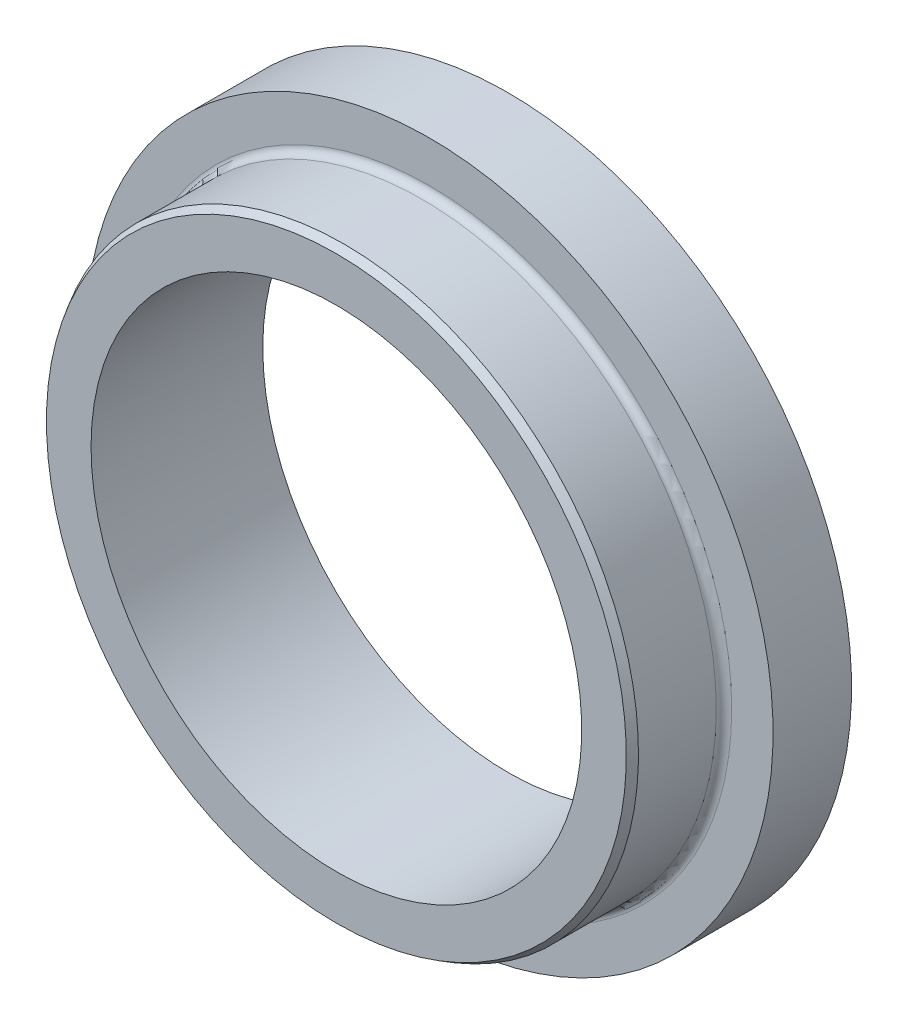
ISO-10303-21;
HEADER;
FILE_DESCRIPTION(('STEP AP214'),'2;1');
FILE_NAME('part.step','',(''),(''),'','','');
FILE_SCHEMA(('AUTOMOTIVE_DESIGN { 1 0 10303 214 1 1 1 1 }'));
ENDSEC;
DATA;
#1=APPLICATION_CONTEXT('core data for automotive mechanical design processes');
#2=APPLICATION_PROTOCOL_DEFINITION('international standard','automotive_design',2000,#1);
#3=PRODUCT_CONTEXT('',#1,'mechanical');
#4=PRODUCT('Part','Part','',(#3));
#5=PRODUCT_RELATED_PRODUCT_CATEGORY('part','',(#4));
#6=PRODUCT_DEFINITION_FORMATION('','',#4);
#7=PRODUCT_DEFINITION_CONTEXT('part definition',#1,'design');
#8=PRODUCT_DEFINITION('design','',#6,#7);
#9=PRODUCT_DEFINITION_SHAPE('','',#8);
#10=(LENGTH_UNIT() NAMED_UNIT(*) SI_UNIT(.MILLI.,.METRE.));
#11=(NAMED_UNIT(*) PLANE_ANGLE_UNIT() SI_UNIT($,.RADIAN.));
#12=(NAMED_UNIT(*) SI_UNIT($,.STERADIAN.) SOLID_ANGLE_UNIT());
#13=UNCERTAINTY_MEASURE_WITH_UNIT(LENGTH_MEASURE(1.E-05),#10,'distance_accuracy_value','');
#14=(GEOMETRIC_REPRESENTATION_CONTEXT(3) GLOBAL_UNCERTAINTY_ASSIGNED_CONTEXT((#13)) GLOBAL_UNIT_ASSIGNED_CONTEXT((#10,
#11,#12)) REPRESENTATION_CONTEXT('',''));
#15=CARTESIAN_POINT('',(0.,0.,0.));
#16=DIRECTION('',(0.,0.,1.));
#17=DIRECTION('',(1.,0.,0.));
#18=AXIS2_PLACEMENT_3D('',#15,#16,#17);
#19=CARTESIAN_POINT('',(0.,0.,11.1125));
#20=DIRECTION('',(0.,0.,-1.));
#21=DIRECTION('',(-1.,0.,0.));
#22=AXIS2_PLACEMENT_3D('',#19,#20,#21);
#23=CYLINDRICAL_SURFACE('',#22,19.05);
#24=CARTESIAN_POINT('',(0.,0.,10.6125));
#25=DIRECTION('',(0.,0.,-1.));
#26=DIRECTION('',(-1.,0.,0.));
#27=AXIS2_PLACEMENT_3D('',#24,#25,#26);
#28=CIRCLE('',#27,19.05);
#29=CARTESIAN_POINT('',(-19.05,0.,10.6125));
#30=VERTEX_POINT('',#29);
#31=EDGE_CURVE('E40',#30,#30,#28,.F.);
#32=ORIENTED_EDGE('',*,*,#31,.F.);
#33=EDGE_LOOP('',(#32));
#34=FACE_BOUND('',#33,.T.);
#35=CARTESIAN_POINT('',(0.,0.,5.58));
#36=DIRECTION('',(0.,0.,-1.));
#37=DIRECTION('',(-1.,0.,0.));
#38=AXIS2_PLACEMENT_3D('',#35,#36,#37);
#39=CIRCLE('',#38,19.05);
#40=CARTESIAN_POINT('',(-19.05,0.,5.58));
#41=VERTEX_POINT('',#40);
#42=EDGE_CURVE('E85',#41,#41,#39,.F.);
#43=ORIENTED_EDGE('',*,*,#42,.T.);
#44=EDGE_LOOP('',(#43));
#45=FACE_BOUND('',#44,.T.);
#46=ADVANCED_FACE('F17',(#34,#45),#23,.T.);
#47=CARTESIAN_POINT('',(0.,0.,5.58000000000001));
#48=DIRECTION('',(0.,0.,-1.));
#49=DIRECTION('',(-1.,0.,0.));
#50=AXIS2_PLACEMENT_3D('',#47,#48,#49);
#51=TOROIDAL_SURFACE('',#50,19.55,0.500000000000009);
#52=ORIENTED_EDGE('',*,*,#42,.F.);
#53=EDGE_LOOP('',(#52));
#54=FACE_BOUND('',#53,.T.);
#55=CARTESIAN_POINT('',(0.,0.,5.08));
#56=DIRECTION('',(0.,0.,1.));
#57=DIRECTION('',(-1.,0.,0.));
#58=AXIS2_PLACEMENT_3D('',#55,#56,#57);
#59=CIRCLE('',#58,19.55);
#60=CARTESIAN_POINT('',(19.55,0.,5.08));
#61=VERTEX_POINT('',#60);
#62=CARTESIAN_POINT('',(-19.55,0.,5.08));
#63=VERTEX_POINT('',#62);
#64=EDGE_CURVE('E33',#61,#63,#59,.F.);
#65=ORIENTED_EDGE('',*,*,#64,.F.);
#66=CARTESIAN_POINT('',(0.,0.,5.08));
#67=DIRECTION('',(0.,0.,1.));
#68=DIRECTION('',(1.,0.,0.));
#69=AXIS2_PLACEMENT_3D('',#66,#67,#68);
#70=CIRCLE('',#69,19.55);
#71=EDGE_CURVE('E36',#63,#61,#70,.F.);
#72=ORIENTED_EDGE('',*,*,#71,.F.);
#73=EDGE_LOOP('',(#65,#72));
#74=FACE_BOUND('',#73,.T.);
#75=ADVANCED_FACE('F37',(#54,#74),#51,.F.);
#76=CARTESIAN_POINT('',(0.,0.,10.6125));
#77=DIRECTION('',(0.,0.,-1.));
#78=DIRECTION('',(0.,1.,0.));
#79=AXIS2_PLACEMENT_3D('',#76,#77,#78);
#80=CONICAL_SURFACE('',#79,19.05,0.523598775598287);
#81=CARTESIAN_POINT('',(0.,0.,11.1125));
#82=DIRECTION('',(0.,0.,-1.));
#83=DIRECTION('',(0.,1.,0.));
#84=AXIS2_PLACEMENT_3D('',#81,#82,#83);
#85=CIRCLE('',#84,18.7613248654052);
#86=CARTESIAN_POINT('',(0.,18.7613248654052,11.1125));
#87=VERTEX_POINT('',#86);
#88=EDGE_CURVE('E44',#87,#87,#85,.F.);
#89=ORIENTED_EDGE('',*,*,#88,.F.);
#90=EDGE_LOOP('',(#89));
#91=FACE_BOUND('',#90,.T.);
#92=ORIENTED_EDGE('',*,*,#31,.T.);
#93=EDGE_LOOP('',(#92));
#94=FACE_BOUND('',#93,.T.);
#95=ADVANCED_FACE('F64',(#91,#94),#80,.T.);
#96=CARTESIAN_POINT('',(22.225,0.,5.08));
#97=DIRECTION('',(0.,0.,1.));
#98=DIRECTION('',(1.,0.,0.));
#99=AXIS2_PLACEMENT_3D('',#96,#97,#98);
#100=PLANE('',#99);
#101=CARTESIAN_POINT('',(0.,0.,5.08));
#102=DIRECTION('',(0.,0.,-1.));
#103=DIRECTION('',(-1.,0.,0.));
#104=AXIS2_PLACEMENT_3D('',#101,#102,#103);
#105=CIRCLE('',#104,22.225);
#106=CARTESIAN_POINT('',(-22.225,0.,5.08));
#107=VERTEX_POINT('',#106);
#108=EDGE_CURVE('E93',#107,#107,#105,.T.);
#109=ORIENTED_EDGE('',*,*,#108,.F.);
#110=EDGE_LOOP('',(#109));
#111=FACE_BOUND('',#110,.T.);
#112=ORIENTED_EDGE('',*,*,#71,.T.);
#113=ORIENTED_EDGE('',*,*,#64,.T.);
#114=EDGE_LOOP('',(#112,#113));
#115=FACE_BOUND('',#114,.T.);
#116=ADVANCED_FACE('F43',(#111,#115),#100,.T.);
#117=CARTESIAN_POINT('',(18.7613248654052,0.,11.1125));
#118=DIRECTION('',(0.,0.,1.));
#119=DIRECTION('',(1.,0.,0.));
#120=AXIS2_PLACEMENT_3D('',#117,#118,#119);
#121=PLANE('',#120);
#122=ORIENTED_EDGE('',*,*,#88,.T.);
#123=EDGE_LOOP('',(#122));
#124=FACE_BOUND('',#123,.T.);
#125=CARTESIAN_POINT('',(0.,0.,11.1125));
#126=DIRECTION('',(0.,0.,-1.));
#127=DIRECTION('',(-1.,0.,0.));
#128=AXIS2_PLACEMENT_3D('',#125,#126,#127);
#129=CIRCLE('',#128,15.875);
#130=CARTESIAN_POINT('',(-15.875,0.,11.1125));
#131=VERTEX_POINT('',#130);
#132=EDGE_CURVE('E90',#131,#131,#129,.T.);
#133=ORIENTED_EDGE('',*,*,#132,.T.);
#134=EDGE_LOOP('',(#133));
#135=FACE_BOUND('',#134,.T.);
#136=ADVANCED_FACE('F63',(#124,#135),#121,.T.);
#137=CARTESIAN_POINT('',(0.,0.,11.1125));
#138=DIRECTION('',(0.,0.,-1.));
#139=DIRECTION('',(-1.,0.,0.));
#140=AXIS2_PLACEMENT_3D('',#137,#138,#139);
#141=CYLINDRICAL_SURFACE('',#140,22.225);
#142=ORIENTED_EDGE('',*,*,#108,.T.);
#143=EDGE_LOOP('',(#142));
#144=FACE_BOUND('',#143,.T.);
#145=CARTESIAN_POINT('',(0.,0.,0.));
#146=DIRECTION('',(0.,0.,-1.));
#147=DIRECTION('',(-1.,0.,0.));
#148=AXIS2_PLACEMENT_3D('',#145,#146,#147);
#149=CIRCLE('',#148,22.225);
#150=CARTESIAN_POINT('',(-22.225,0.,0.));
#151=VERTEX_POINT('',#150);
#152=EDGE_CURVE('E27',#151,#151,#149,.T.);
#153=ORIENTED_EDGE('',*,*,#152,.F.);
#154=EDGE_LOOP('',(#153));
#155=FACE_BOUND('',#154,.T.);
#156=ADVANCED_FACE('F116',(#144,#155),#141,.T.);
#157=CARTESIAN_POINT('',(0.,0.,11.1125));
#158=DIRECTION('',(0.,0.,-1.));
#159=DIRECTION('',(-1.,0.,0.));
#160=AXIS2_PLACEMENT_3D('',#157,#158,#159);
#161=CYLINDRICAL_SURFACE('',#160,15.875);
#162=CARTESIAN_POINT('',(0.,0.,0.));
#163=DIRECTION('',(0.,0.,-1.));
#164=DIRECTION('',(-1.,0.,0.));
#165=AXIS2_PLACEMENT_3D('',#162,#163,#164);
#166=CIRCLE('',#165,15.875);
#167=CARTESIAN_POINT('',(-15.875,0.,0.));
#168=VERTEX_POINT('',#167);
#169=EDGE_CURVE('E11',#168,#168,#166,.F.);
#170=ORIENTED_EDGE('',*,*,#169,.F.);
#171=EDGE_LOOP('',(#170));
#172=FACE_BOUND('',#171,.T.);
#173=ORIENTED_EDGE('',*,*,#132,.F.);
#174=EDGE_LOOP('',(#173));
#175=FACE_BOUND('',#174,.T.);
#176=ADVANCED_FACE('F110',(#172,#175),#161,.F.);
#177=CARTESIAN_POINT('',(15.875,0.,0.));
#178=DIRECTION('',(0.,0.,-1.));
#179=DIRECTION('',(-1.,0.,0.));
#180=AXIS2_PLACEMENT_3D('',#177,#178,#179);
#181=PLANE('',#180);
#182=ORIENTED_EDGE('',*,*,#169,.T.);
#183=EDGE_LOOP('',(#182));
#184=FACE_BOUND('',#183,.T.);
#185=ORIENTED_EDGE('',*,*,#152,.T.);
#186=EDGE_LOOP('',(#185));
#187=FACE_BOUND('',#186,.T.);
#188=ADVANCED_FACE('F108',(#184,#187),#181,.T.);
#189=CLOSED_SHELL('',(#46,#75,#95,#116,#136,#156,#176,#188));
#190=MANIFOLD_SOLID_BREP('B1',#189);
#191=ADVANCED_BREP_SHAPE_REPRESENTATION('',(#18,#190),#14);
#192=SHAPE_DEFINITION_REPRESENTATION(#9,#191);
ENDSEC;
END-ISO-10303-21;
